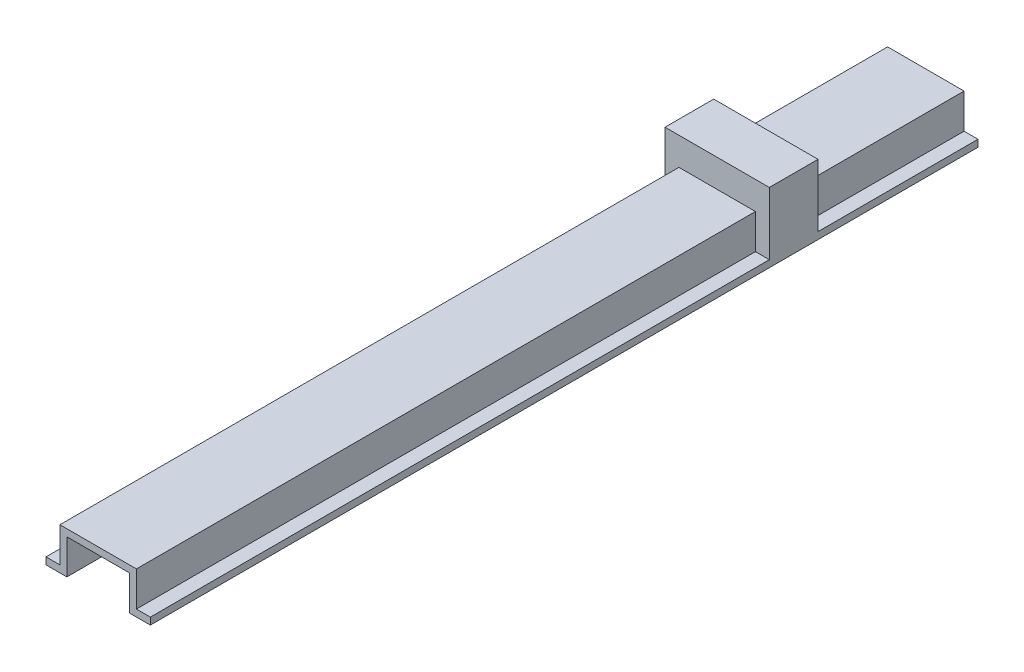
ISO-10303-21;
HEADER;
FILE_DESCRIPTION(('STEP AP214'),'2;1');
FILE_NAME('part.step','',(''),(''),'','','');
FILE_SCHEMA(('AUTOMOTIVE_DESIGN { 1 0 10303 214 1 1 1 1 }'));
ENDSEC;
DATA;
#1=APPLICATION_CONTEXT('core data for automotive mechanical design processes');
#2=APPLICATION_PROTOCOL_DEFINITION('international standard','automotive_design',2000,#1);
#3=PRODUCT_CONTEXT('',#1,'mechanical');
#4=PRODUCT('Part','Part','',(#3));
#5=PRODUCT_RELATED_PRODUCT_CATEGORY('part','',(#4));
#6=PRODUCT_DEFINITION_FORMATION('','',#4);
#7=PRODUCT_DEFINITION_CONTEXT('part definition',#1,'design');
#8=PRODUCT_DEFINITION('design','',#6,#7);
#9=PRODUCT_DEFINITION_SHAPE('','',#8);
#10=(LENGTH_UNIT() NAMED_UNIT(*) SI_UNIT(.MILLI.,.METRE.));
#11=(NAMED_UNIT(*) PLANE_ANGLE_UNIT() SI_UNIT($,.RADIAN.));
#12=(NAMED_UNIT(*) SI_UNIT($,.STERADIAN.) SOLID_ANGLE_UNIT());
#13=UNCERTAINTY_MEASURE_WITH_UNIT(LENGTH_MEASURE(1.E-05),#10,'distance_accuracy_value','');
#14=(GEOMETRIC_REPRESENTATION_CONTEXT(3) GLOBAL_UNCERTAINTY_ASSIGNED_CONTEXT((#13)) GLOBAL_UNIT_ASSIGNED_CONTEXT((#10,
#11,#12)) REPRESENTATION_CONTEXT('',''));
#15=CARTESIAN_POINT('',(0.,0.,0.));
#16=DIRECTION('',(0.,0.,1.));
#17=DIRECTION('',(1.,0.,0.));
#18=AXIS2_PLACEMENT_3D('',#15,#16,#17);
#19=CARTESIAN_POINT('',(-4.36598484476296,1.814,119.));
#20=DIRECTION('',(0.,1.,0.));
#21=DIRECTION('',(-1.,0.,0.));
#22=AXIS2_PLACEMENT_3D('',#19,#20,#21);
#23=PLANE('',#22);
#24=DIRECTION('',(0.,0.,-1.));
#25=VECTOR('',#24,1.);
#26=CARTESIAN_POINT('',(4.63401515523704,1.814,119.));
#27=LINE('',#26,#25);
#28=CARTESIAN_POINT('',(4.63401515523704,1.814,24.));
#29=VERTEX_POINT('',#28);
#30=CARTESIAN_POINT('',(4.63401515523704,1.814,0.));
#31=VERTEX_POINT('',#30);
#32=EDGE_CURVE('E320',#29,#31,#27,.T.);
#33=ORIENTED_EDGE('',*,*,#32,.F.);
#34=DIRECTION('',(-1.,0.,0.));
#35=VECTOR('',#34,1.);
#36=CARTESIAN_POINT('',(-4.36598484476296,1.814,24.));
#37=LINE('',#36,#35);
#38=CARTESIAN_POINT('',(-4.36598484476296,1.814,24.));
#39=VERTEX_POINT('',#38);
#40=EDGE_CURVE('E250',#29,#39,#37,.T.);
#41=ORIENTED_EDGE('',*,*,#40,.T.);
#42=DIRECTION('',(0.,0.,-1.));
#43=VECTOR('',#42,1.);
#44=CARTESIAN_POINT('',(-4.36598484476296,1.814,119.));
#45=LINE('',#44,#43);
#46=CARTESIAN_POINT('',(-4.36598484476296,1.814,0.));
#47=VERTEX_POINT('',#46);
#48=EDGE_CURVE('E353',#39,#47,#45,.T.);
#49=ORIENTED_EDGE('',*,*,#48,.T.);
#50=DIRECTION('',(1.,0.,0.));
#51=VECTOR('',#50,1.);
#52=CARTESIAN_POINT('',(-4.36598484476296,1.814,0.));
#53=LINE('',#52,#51);
#54=EDGE_CURVE('E348',#47,#31,#53,.T.);
#55=ORIENTED_EDGE('',*,*,#54,.T.);
#56=EDGE_LOOP('',(#33,#41,#49,#55));
#57=FACE_BOUND('',#56,.T.);
#58=ADVANCED_FACE('F33',(#57),#23,.F.);
#59=CARTESIAN_POINT('',(7.63401515523704,-2.186,119.));
#60=DIRECTION('',(0.,-1.,0.));
#61=DIRECTION('',(1.,0.,0.));
#62=AXIS2_PLACEMENT_3D('',#59,#60,#61);
#63=PLANE('',#62);
#64=DIRECTION('',(-1.,0.,0.));
#65=VECTOR('',#64,1.);
#66=CARTESIAN_POINT('',(-7.36598484476296,-2.186,23.));
#67=LINE('',#66,#65);
#68=CARTESIAN_POINT('',(7.63401515523704,-2.18599999999999,23.));
#69=VERTEX_POINT('',#68);
#70=CARTESIAN_POINT('',(5.63401515523704,-2.18599999999999,23.));
#71=VERTEX_POINT('',#70);
#72=EDGE_CURVE('E268',#69,#71,#67,.T.);
#73=ORIENTED_EDGE('',*,*,#72,.F.);
#74=DIRECTION('',(0.,0.,-1.));
#75=VECTOR('',#74,1.);
#76=CARTESIAN_POINT('',(7.63401515523704,-2.186,119.));
#77=LINE('',#76,#75);
#78=CARTESIAN_POINT('',(7.63401515523704,-2.186,0.));
#79=VERTEX_POINT('',#78);
#80=EDGE_CURVE('E383',#69,#79,#77,.T.);
#81=ORIENTED_EDGE('',*,*,#80,.T.);
#82=DIRECTION('',(-1.,0.,0.));
#83=VECTOR('',#82,1.);
#84=CARTESIAN_POINT('',(7.63401515523704,-2.186,0.));
#85=LINE('',#84,#83);
#86=CARTESIAN_POINT('',(5.63401515523704,-2.186,0.));
#87=VERTEX_POINT('',#86);
#88=EDGE_CURVE('E325',#79,#87,#85,.T.);
#89=ORIENTED_EDGE('',*,*,#88,.T.);
#90=DIRECTION('',(0.,0.,-1.));
#91=VECTOR('',#90,1.);
#92=CARTESIAN_POINT('',(5.63401515523704,-2.186,119.));
#93=LINE('',#92,#91);
#94=EDGE_CURVE('E379',#71,#87,#93,.T.);
#95=ORIENTED_EDGE('',*,*,#94,.F.);
#96=EDGE_LOOP('',(#73,#81,#89,#95));
#97=FACE_BOUND('',#96,.T.);
#98=ADVANCED_FACE('F405',(#97),#63,.F.);
#99=DIRECTION('',(1.,0.,0.));
#100=VECTOR('',#99,1.);
#101=CARTESIAN_POINT('',(-7.36598484476296,-2.186,30.));
#102=LINE('',#101,#100);
#103=CARTESIAN_POINT('',(5.63401515523704,-2.18599999999999,30.));
#104=VERTEX_POINT('',#103);
#105=CARTESIAN_POINT('',(7.63401515523704,-2.18599999999999,30.));
#106=VERTEX_POINT('',#105);
#107=EDGE_CURVE('E270',#104,#106,#102,.T.);
#108=ORIENTED_EDGE('',*,*,#107,.F.);
#109=CARTESIAN_POINT('',(5.63401515523704,-2.186,119.));
#110=VERTEX_POINT('',#109);
#111=EDGE_CURVE('E380',#110,#104,#93,.T.);
#112=ORIENTED_EDGE('',*,*,#111,.F.);
#113=DIRECTION('',(-1.,0.,0.));
#114=VECTOR('',#113,1.);
#115=CARTESIAN_POINT('',(7.63401515523704,-2.186,119.));
#116=LINE('',#115,#114);
#117=CARTESIAN_POINT('',(7.63401515523704,-2.186,119.));
#118=VERTEX_POINT('',#117);
#119=EDGE_CURVE('E301',#118,#110,#116,.T.);
#120=ORIENTED_EDGE('',*,*,#119,.F.);
#121=EDGE_CURVE('E384',#118,#106,#77,.T.);
#122=ORIENTED_EDGE('',*,*,#121,.T.);
#123=EDGE_LOOP('',(#108,#112,#120,#122));
#124=FACE_BOUND('',#123,.T.);
#125=ADVANCED_FACE('F424',(#124),#63,.F.);
#126=CARTESIAN_POINT('',(5.63401515523704,2.814,119.));
#127=DIRECTION('',(-1.,0.,0.));
#128=DIRECTION('',(0.,-1.,0.));
#129=AXIS2_PLACEMENT_3D('',#126,#127,#128);
#130=PLANE('',#129);
#131=DIRECTION('',(0.,1.,0.));
#132=VECTOR('',#131,1.);
#133=CARTESIAN_POINT('',(5.63401515523704,2.814,23.));
#134=LINE('',#133,#132);
#135=CARTESIAN_POINT('',(5.63401515523704,2.814,23.));
#136=VERTEX_POINT('',#135);
#137=EDGE_CURVE('E290',#71,#136,#134,.T.);
#138=ORIENTED_EDGE('',*,*,#137,.F.);
#139=ORIENTED_EDGE('',*,*,#94,.T.);
#140=DIRECTION('',(0.,1.,0.));
#141=VECTOR('',#140,1.);
#142=CARTESIAN_POINT('',(5.63401515523704,2.814,0.));
#143=LINE('',#142,#141);
#144=CARTESIAN_POINT('',(5.63401515523704,2.814,0.));
#145=VERTEX_POINT('',#144);
#146=EDGE_CURVE('E328',#87,#145,#143,.T.);
#147=ORIENTED_EDGE('',*,*,#146,.T.);
#148=DIRECTION('',(0.,0.,-1.));
#149=VECTOR('',#148,1.);
#150=CARTESIAN_POINT('',(5.63401515523704,2.814,119.));
#151=LINE('',#150,#149);
#152=EDGE_CURVE('E375',#136,#145,#151,.T.);
#153=ORIENTED_EDGE('',*,*,#152,.F.);
#154=EDGE_LOOP('',(#138,#139,#147,#153));
#155=FACE_BOUND('',#154,.T.);
#156=ADVANCED_FACE('F465',(#155),#130,.F.);
#157=DIRECTION('',(0.,-1.,0.));
#158=VECTOR('',#157,1.);
#159=CARTESIAN_POINT('',(5.63401515523704,2.814,30.));
#160=LINE('',#159,#158);
#161=CARTESIAN_POINT('',(5.63401515523704,2.814,30.));
#162=VERTEX_POINT('',#161);
#163=EDGE_CURVE('E284',#162,#104,#160,.T.);
#164=ORIENTED_EDGE('',*,*,#163,.F.);
#165=CARTESIAN_POINT('',(5.63401515523704,2.814,119.));
#166=VERTEX_POINT('',#165);
#167=EDGE_CURVE('E376',#166,#162,#151,.T.);
#168=ORIENTED_EDGE('',*,*,#167,.F.);
#169=DIRECTION('',(0.,1.,0.));
#170=VECTOR('',#169,1.);
#171=CARTESIAN_POINT('',(5.63401515523704,2.814,119.));
#172=LINE('',#171,#170);
#173=EDGE_CURVE('E303',#110,#166,#172,.T.);
#174=ORIENTED_EDGE('',*,*,#173,.F.);
#175=ORIENTED_EDGE('',*,*,#111,.T.);
#176=EDGE_LOOP('',(#164,#168,#174,#175));
#177=FACE_BOUND('',#176,.T.);
#178=ADVANCED_FACE('F467',(#177),#130,.F.);
#179=CARTESIAN_POINT('',(-5.36598484476296,2.814,119.));
#180=DIRECTION('',(0.,-1.,0.));
#181=DIRECTION('',(1.,0.,0.));
#182=AXIS2_PLACEMENT_3D('',#179,#180,#181);
#183=PLANE('',#182);
#184=DIRECTION('',(-1.,0.,0.));
#185=VECTOR('',#184,1.);
#186=CARTESIAN_POINT('',(-5.36598484476296,2.814,23.));
#187=LINE('',#186,#185);
#188=CARTESIAN_POINT('',(-5.36598484476296,2.814,23.));
#189=VERTEX_POINT('',#188);
#190=EDGE_CURVE('E288',#136,#189,#187,.T.);
#191=ORIENTED_EDGE('',*,*,#190,.F.);
#192=ORIENTED_EDGE('',*,*,#152,.T.);
#193=DIRECTION('',(-1.,0.,0.));
#194=VECTOR('',#193,1.);
#195=CARTESIAN_POINT('',(-5.36598484476296,2.814,0.));
#196=LINE('',#195,#194);
#197=CARTESIAN_POINT('',(-5.36598484476296,2.814,0.));
#198=VERTEX_POINT('',#197);
#199=EDGE_CURVE('E331',#145,#198,#196,.T.);
#200=ORIENTED_EDGE('',*,*,#199,.T.);
#201=DIRECTION('',(0.,0.,-1.));
#202=VECTOR('',#201,1.);
#203=CARTESIAN_POINT('',(-5.36598484476296,2.814,119.));
#204=LINE('',#203,#202);
#205=EDGE_CURVE('E371',#189,#198,#204,.T.);
#206=ORIENTED_EDGE('',*,*,#205,.F.);
#207=EDGE_LOOP('',(#191,#192,#200,#206));
#208=FACE_BOUND('',#207,.T.);
#209=ADVANCED_FACE('F462',(#208),#183,.F.);
#210=DIRECTION('',(1.,0.,0.));
#211=VECTOR('',#210,1.);
#212=CARTESIAN_POINT('',(-5.36598484476296,2.814,30.));
#213=LINE('',#212,#211);
#214=CARTESIAN_POINT('',(-5.36598484476296,2.814,30.));
#215=VERTEX_POINT('',#214);
#216=EDGE_CURVE('E282',#215,#162,#213,.T.);
#217=ORIENTED_EDGE('',*,*,#216,.F.);
#218=CARTESIAN_POINT('',(-5.36598484476296,2.814,119.));
#219=VERTEX_POINT('',#218);
#220=EDGE_CURVE('E372',#219,#215,#204,.T.);
#221=ORIENTED_EDGE('',*,*,#220,.F.);
#222=DIRECTION('',(-1.,0.,0.));
#223=VECTOR('',#222,1.);
#224=CARTESIAN_POINT('',(-5.36598484476296,2.814,119.));
#225=LINE('',#224,#223);
#226=EDGE_CURVE('E305',#166,#219,#225,.T.);
#227=ORIENTED_EDGE('',*,*,#226,.F.);
#228=ORIENTED_EDGE('',*,*,#167,.T.);
#229=EDGE_LOOP('',(#217,#221,#227,#228));
#230=FACE_BOUND('',#229,.T.);
#231=ADVANCED_FACE('F511',(#230),#183,.F.);
#232=CARTESIAN_POINT('',(-5.36598484476296,2.814,119.));
#233=DIRECTION('',(1.,0.,0.));
#234=DIRECTION('',(0.,1.,0.));
#235=AXIS2_PLACEMENT_3D('',#232,#233,#234);
#236=PLANE('',#235);
#237=DIRECTION('',(0.,-1.,0.));
#238=VECTOR('',#237,1.);
#239=CARTESIAN_POINT('',(-5.36598484476296,2.814,23.));
#240=LINE('',#239,#238);
#241=CARTESIAN_POINT('',(-5.36598484476296,-2.186,23.));
#242=VERTEX_POINT('',#241);
#243=EDGE_CURVE('E286',#189,#242,#240,.T.);
#244=ORIENTED_EDGE('',*,*,#243,.F.);
#245=ORIENTED_EDGE('',*,*,#205,.T.);
#246=DIRECTION('',(0.,-1.,0.));
#247=VECTOR('',#246,1.);
#248=CARTESIAN_POINT('',(-5.36598484476296,2.814,0.));
#249=LINE('',#248,#247);
#250=CARTESIAN_POINT('',(-5.36598484476296,-2.186,0.));
#251=VERTEX_POINT('',#250);
#252=EDGE_CURVE('E334',#198,#251,#249,.T.);
#253=ORIENTED_EDGE('',*,*,#252,.T.);
#254=DIRECTION('',(0.,0.,-1.));
#255=VECTOR('',#254,1.);
#256=CARTESIAN_POINT('',(-5.36598484476296,-2.186,119.));
#257=LINE('',#256,#255);
#258=EDGE_CURVE('E367',#242,#251,#257,.T.);
#259=ORIENTED_EDGE('',*,*,#258,.F.);
#260=EDGE_LOOP('',(#244,#245,#253,#259));
#261=FACE_BOUND('',#260,.T.);
#262=ADVANCED_FACE('F458',(#261),#236,.F.);
#263=DIRECTION('',(0.,1.,0.));
#264=VECTOR('',#263,1.);
#265=CARTESIAN_POINT('',(-5.36598484476296,2.814,30.));
#266=LINE('',#265,#264);
#267=CARTESIAN_POINT('',(-5.36598484476296,-2.186,30.));
#268=VERTEX_POINT('',#267);
#269=EDGE_CURVE('E280',#268,#215,#266,.T.);
#270=ORIENTED_EDGE('',*,*,#269,.F.);
#271=CARTESIAN_POINT('',(-5.36598484476296,-2.186,119.));
#272=VERTEX_POINT('',#271);
#273=EDGE_CURVE('E368',#272,#268,#257,.T.);
#274=ORIENTED_EDGE('',*,*,#273,.F.);
#275=DIRECTION('',(0.,-1.,0.));
#276=VECTOR('',#275,1.);
#277=CARTESIAN_POINT('',(-5.36598484476296,2.814,119.));
#278=LINE('',#277,#276);
#279=EDGE_CURVE('E307',#219,#272,#278,.T.);
#280=ORIENTED_EDGE('',*,*,#279,.F.);
#281=ORIENTED_EDGE('',*,*,#220,.T.);
#282=EDGE_LOOP('',(#270,#274,#280,#281));
#283=FACE_BOUND('',#282,.T.);
#284=ADVANCED_FACE('F509',(#283),#236,.F.);
#285=CARTESIAN_POINT('',(-5.36598484476296,-2.186,119.));
#286=DIRECTION('',(0.,-1.,0.));
#287=DIRECTION('',(1.,0.,0.));
#288=AXIS2_PLACEMENT_3D('',#285,#286,#287);
#289=PLANE('',#288);
#290=CARTESIAN_POINT('',(-7.36598484476296,-2.186,23.));
#291=VERTEX_POINT('',#290);
#292=EDGE_CURVE('E256',#242,#291,#67,.T.);
#293=ORIENTED_EDGE('',*,*,#292,.F.);
#294=ORIENTED_EDGE('',*,*,#258,.T.);
#295=DIRECTION('',(-1.,0.,0.));
#296=VECTOR('',#295,1.);
#297=CARTESIAN_POINT('',(-5.36598484476296,-2.186,0.));
#298=LINE('',#297,#296);
#299=CARTESIAN_POINT('',(-7.36598484476296,-2.186,0.));
#300=VERTEX_POINT('',#299);
#301=EDGE_CURVE('E337',#251,#300,#298,.T.);
#302=ORIENTED_EDGE('',*,*,#301,.T.);
#303=DIRECTION('',(0.,0.,-1.));
#304=VECTOR('',#303,1.);
#305=CARTESIAN_POINT('',(-7.36598484476296,-2.186,119.));
#306=LINE('',#305,#304);
#307=EDGE_CURVE('E363',#291,#300,#306,.T.);
#308=ORIENTED_EDGE('',*,*,#307,.F.);
#309=EDGE_LOOP('',(#293,#294,#302,#308));
#310=FACE_BOUND('',#309,.T.);
#311=ADVANCED_FACE('F454',(#310),#289,.F.);
#312=CARTESIAN_POINT('',(-7.36598484476296,-2.186,30.));
#313=VERTEX_POINT('',#312);
#314=EDGE_CURVE('E261',#313,#268,#102,.T.);
#315=ORIENTED_EDGE('',*,*,#314,.F.);
#316=CARTESIAN_POINT('',(-7.36598484476296,-2.186,119.));
#317=VERTEX_POINT('',#316);
#318=EDGE_CURVE('E364',#317,#313,#306,.T.);
#319=ORIENTED_EDGE('',*,*,#318,.F.);
#320=DIRECTION('',(-1.,0.,0.));
#321=VECTOR('',#320,1.);
#322=CARTESIAN_POINT('',(-5.36598484476296,-2.186,119.));
#323=LINE('',#322,#321);
#324=EDGE_CURVE('E309',#272,#317,#323,.T.);
#325=ORIENTED_EDGE('',*,*,#324,.F.);
#326=ORIENTED_EDGE('',*,*,#273,.T.);
#327=EDGE_LOOP('',(#315,#319,#325,#326));
#328=FACE_BOUND('',#327,.T.);
#329=ADVANCED_FACE('F491',(#328),#289,.F.);
#330=CARTESIAN_POINT('',(-4.36598484476296,1.814,119.));
#331=DIRECTION('',(-1.,0.,0.));
#332=DIRECTION('',(0.,0.,1.));
#333=AXIS2_PLACEMENT_3D('',#330,#331,#332);
#334=PLANE('',#333);
#335=ORIENTED_EDGE('',*,*,#48,.F.);
#336=DIRECTION('',(0.,-1.,0.));
#337=VECTOR('',#336,1.);
#338=CARTESIAN_POINT('',(-4.36598484476296,1.814,24.));
#339=LINE('',#338,#337);
#340=CARTESIAN_POINT('',(-4.36598484476296,-1.186,24.));
#341=VERTEX_POINT('',#340);
#342=EDGE_CURVE('E253',#39,#341,#339,.T.);
#343=ORIENTED_EDGE('',*,*,#342,.T.);
#344=DIRECTION('',(0.,0.,1.));
#345=VECTOR('',#344,1.);
#346=CARTESIAN_POINT('',(-4.36598484476296,-1.186,119.));
#347=LINE('',#346,#345);
#348=CARTESIAN_POINT('',(-4.36598484476296,-1.186,29.));
#349=VERTEX_POINT('',#348);
#350=EDGE_CURVE('E240',#341,#349,#347,.T.);
#351=ORIENTED_EDGE('',*,*,#350,.T.);
#352=DIRECTION('',(0.,1.,0.));
#353=VECTOR('',#352,1.);
#354=CARTESIAN_POINT('',(-4.36598484476296,1.814,29.));
#355=LINE('',#354,#353);
#356=CARTESIAN_POINT('',(-4.36598484476296,1.814,29.));
#357=VERTEX_POINT('',#356);
#358=EDGE_CURVE('E247',#349,#357,#355,.T.);
#359=ORIENTED_EDGE('',*,*,#358,.T.);
#360=CARTESIAN_POINT('',(-4.36598484476296,1.814,119.));
#361=VERTEX_POINT('',#360);
#362=EDGE_CURVE('E354',#361,#357,#45,.T.);
#363=ORIENTED_EDGE('',*,*,#362,.F.);
#364=DIRECTION('',(0.,1.,0.));
#365=VECTOR('',#364,1.);
#366=CARTESIAN_POINT('',(-4.36598484476296,-2.186,119.));
#367=LINE('',#366,#365);
#368=CARTESIAN_POINT('',(-4.36598484476296,-3.186,119.));
#369=VERTEX_POINT('',#368);
#370=EDGE_CURVE('E315',#369,#361,#367,.T.);
#371=ORIENTED_EDGE('',*,*,#370,.F.);
#372=DIRECTION('',(0.,0.,-1.));
#373=VECTOR('',#372,1.);
#374=CARTESIAN_POINT('',(-4.36598484476296,-3.186,119.));
#375=LINE('',#374,#373);
#376=CARTESIAN_POINT('',(-4.36598484476296,-3.186,0.));
#377=VERTEX_POINT('',#376);
#378=EDGE_CURVE('E357',#369,#377,#375,.T.);
#379=ORIENTED_EDGE('',*,*,#378,.T.);
#380=DIRECTION('',(0.,1.,0.));
#381=VECTOR('',#380,1.);
#382=CARTESIAN_POINT('',(-4.36598484476296,1.814,0.));
#383=LINE('',#382,#381);
#384=EDGE_CURVE('E345',#377,#47,#383,.T.);
#385=ORIENTED_EDGE('',*,*,#384,.T.);
#386=EDGE_LOOP('',(#335,#343,#351,#359,#363,#371,#379,#385));
#387=FACE_BOUND('',#386,.T.);
#388=ADVANCED_FACE('F437',(#387),#334,.F.);
#389=ORIENTED_EDGE('',*,*,#362,.T.);
#390=DIRECTION('',(1.,0.,0.));
#391=VECTOR('',#390,1.);
#392=CARTESIAN_POINT('',(-4.36598484476296,1.814,29.));
#393=LINE('',#392,#391);
#394=CARTESIAN_POINT('',(4.63401515523704,1.814,29.));
#395=VERTEX_POINT('',#394);
#396=EDGE_CURVE('E245',#357,#395,#393,.T.);
#397=ORIENTED_EDGE('',*,*,#396,.T.);
#398=CARTESIAN_POINT('',(4.63401515523704,1.814,119.));
#399=VERTEX_POINT('',#398);
#400=EDGE_CURVE('E212',#399,#395,#27,.T.);
#401=ORIENTED_EDGE('',*,*,#400,.F.);
#402=DIRECTION('',(1.,0.,0.));
#403=VECTOR('',#402,1.);
#404=CARTESIAN_POINT('',(-4.36598484476296,1.814,119.));
#405=LINE('',#404,#403);
#406=EDGE_CURVE('E317',#361,#399,#405,.T.);
#407=ORIENTED_EDGE('',*,*,#406,.F.);
#408=EDGE_LOOP('',(#389,#397,#401,#407));
#409=FACE_BOUND('',#408,.T.);
#410=ADVANCED_FACE('F478',(#409),#23,.F.);
#411=CARTESIAN_POINT('',(4.63401515523704,1.814,119.));
#412=DIRECTION('',(1.,0.,0.));
#413=DIRECTION('',(0.,0.,-1.));
#414=AXIS2_PLACEMENT_3D('',#411,#412,#413);
#415=PLANE('',#414);
#416=ORIENTED_EDGE('',*,*,#400,.T.);
#417=DIRECTION('',(0.,1.,0.));
#418=VECTOR('',#417,1.);
#419=CARTESIAN_POINT('',(4.63401515523704,5.81400000000001,29.));
#420=LINE('',#419,#418);
#421=CARTESIAN_POINT('',(4.63401515523704,5.81400000000001,29.));
#422=VERTEX_POINT('',#421);
#423=EDGE_CURVE('E206',#395,#422,#420,.T.);
#424=ORIENTED_EDGE('',*,*,#423,.T.);
#425=DIRECTION('',(0.,0.,-1.));
#426=VECTOR('',#425,1.);
#427=CARTESIAN_POINT('',(4.63401515523704,5.81400000000001,24.));
#428=LINE('',#427,#426);
#429=CARTESIAN_POINT('',(4.63401515523704,5.81400000000001,24.));
#430=VERTEX_POINT('',#429);
#431=EDGE_CURVE('E210',#422,#430,#428,.T.);
#432=ORIENTED_EDGE('',*,*,#431,.T.);
#433=DIRECTION('',(0.,-1.,0.));
#434=VECTOR('',#433,1.);
#435=CARTESIAN_POINT('',(4.63401515523704,5.81400000000001,24.));
#436=LINE('',#435,#434);
#437=EDGE_CURVE('E48',#430,#29,#436,.T.);
#438=ORIENTED_EDGE('',*,*,#437,.T.);
#439=ORIENTED_EDGE('',*,*,#32,.T.);
#440=DIRECTION('',(0.,-1.,0.));
#441=VECTOR('',#440,1.);
#442=CARTESIAN_POINT('',(4.63401515523704,1.814,0.));
#443=LINE('',#442,#441);
#444=CARTESIAN_POINT('',(4.63401515523704,-3.186,0.));
#445=VERTEX_POINT('',#444);
#446=EDGE_CURVE('E297',#31,#445,#443,.T.);
#447=ORIENTED_EDGE('',*,*,#446,.T.);
#448=DIRECTION('',(0.,0.,-1.));
#449=VECTOR('',#448,1.);
#450=CARTESIAN_POINT('',(4.63401515523704,-3.186,119.));
#451=LINE('',#450,#449);
#452=CARTESIAN_POINT('',(4.63401515523704,-3.186,119.));
#453=VERTEX_POINT('',#452);
#454=EDGE_CURVE('E11',#453,#445,#451,.T.);
#455=ORIENTED_EDGE('',*,*,#454,.F.);
#456=DIRECTION('',(0.,-1.,0.));
#457=VECTOR('',#456,1.);
#458=CARTESIAN_POINT('',(4.63401515523704,-2.186,119.));
#459=LINE('',#458,#457);
#460=EDGE_CURVE('E293',#399,#453,#459,.T.);
#461=ORIENTED_EDGE('',*,*,#460,.F.);
#462=EDGE_LOOP('',(#416,#424,#432,#438,#439,#447,#455,#461));
#463=FACE_BOUND('',#462,.T.);
#464=ADVANCED_FACE('F208',(#463),#415,.F.);
#465=CARTESIAN_POINT('',(4.63401515523704,-3.186,119.));
#466=DIRECTION('',(0.,1.,0.));
#467=DIRECTION('',(0.,0.,1.));
#468=AXIS2_PLACEMENT_3D('',#465,#466,#467);
#469=PLANE('',#468);
#470=DIRECTION('',(1.,0.,0.));
#471=VECTOR('',#470,1.);
#472=CARTESIAN_POINT('',(4.63401515523704,-3.186,0.));
#473=LINE('',#472,#471);
#474=CARTESIAN_POINT('',(7.63401515523704,-3.186,0.));
#475=VERTEX_POINT('',#474);
#476=EDGE_CURVE('E292',#445,#475,#473,.T.);
#477=ORIENTED_EDGE('',*,*,#476,.T.);
#478=DIRECTION('',(0.,0.,-1.));
#479=VECTOR('',#478,1.);
#480=CARTESIAN_POINT('',(7.63401515523704,-3.186,119.));
#481=LINE('',#480,#479);
#482=CARTESIAN_POINT('',(7.63401515523704,-3.186,119.));
#483=VERTEX_POINT('',#482);
#484=EDGE_CURVE('E41',#483,#475,#481,.T.);
#485=ORIENTED_EDGE('',*,*,#484,.F.);
#486=DIRECTION('',(1.,0.,0.));
#487=VECTOR('',#486,1.);
#488=CARTESIAN_POINT('',(4.63401515523704,-3.186,119.));
#489=LINE('',#488,#487);
#490=EDGE_CURVE('E296',#453,#483,#489,.T.);
#491=ORIENTED_EDGE('',*,*,#490,.F.);
#492=ORIENTED_EDGE('',*,*,#454,.T.);
#493=EDGE_LOOP('',(#477,#485,#491,#492));
#494=FACE_BOUND('',#493,.T.);
#495=ADVANCED_FACE('F35',(#494),#469,.F.);
#496=CARTESIAN_POINT('',(7.63401515523704,-2.186,119.));
#497=DIRECTION('',(-1.,0.,0.));
#498=DIRECTION('',(0.,0.,1.));
#499=AXIS2_PLACEMENT_3D('',#496,#497,#498);
#500=PLANE('',#499);
#501=DIRECTION('',(0.,1.,0.));
#502=VECTOR('',#501,1.);
#503=CARTESIAN_POINT('',(7.63401515523704,-2.186,0.));
#504=LINE('',#503,#502);
#505=EDGE_CURVE('E322',#475,#79,#504,.T.);
#506=ORIENTED_EDGE('',*,*,#505,.T.);
#507=ORIENTED_EDGE('',*,*,#80,.F.);
#508=DIRECTION('',(0.,-1.,0.));
#509=VECTOR('',#508,1.);
#510=CARTESIAN_POINT('',(7.63401515523704,6.81400000000001,23.));
#511=LINE('',#510,#509);
#512=CARTESIAN_POINT('',(7.63401515523704,6.81400000000001,23.));
#513=VERTEX_POINT('',#512);
#514=EDGE_CURVE('E278',#513,#69,#511,.T.);
#515=ORIENTED_EDGE('',*,*,#514,.F.);
#516=DIRECTION('',(0.,0.,-1.));
#517=VECTOR('',#516,1.);
#518=CARTESIAN_POINT('',(7.63401515523704,6.81400000000001,23.));
#519=LINE('',#518,#517);
#520=CARTESIAN_POINT('',(7.63401515523704,6.81400000000001,30.));
#521=VERTEX_POINT('',#520);
#522=EDGE_CURVE('E257',#521,#513,#519,.T.);
#523=ORIENTED_EDGE('',*,*,#522,.F.);
#524=DIRECTION('',(0.,-1.,0.));
#525=VECTOR('',#524,1.);
#526=CARTESIAN_POINT('',(7.63401515523704,6.81400000000001,30.));
#527=LINE('',#526,#525);
#528=EDGE_CURVE('E267',#521,#106,#527,.T.);
#529=ORIENTED_EDGE('',*,*,#528,.T.);
#530=ORIENTED_EDGE('',*,*,#121,.F.);
#531=DIRECTION('',(0.,1.,0.));
#532=VECTOR('',#531,1.);
#533=CARTESIAN_POINT('',(7.63401515523704,-2.186,119.));
#534=LINE('',#533,#532);
#535=EDGE_CURVE('E299',#483,#118,#534,.T.);
#536=ORIENTED_EDGE('',*,*,#535,.F.);
#537=ORIENTED_EDGE('',*,*,#484,.T.);
#538=EDGE_LOOP('',(#506,#507,#515,#523,#529,#530,#536,#537));
#539=FACE_BOUND('',#538,.T.);
#540=ADVANCED_FACE('F391',(#539),#500,.F.);
#541=CARTESIAN_POINT('',(-7.36598484476296,-2.186,119.));
#542=DIRECTION('',(1.,0.,0.));
#543=DIRECTION('',(0.,1.,0.));
#544=AXIS2_PLACEMENT_3D('',#541,#542,#543);
#545=PLANE('',#544);
#546=DIRECTION('',(0.,0.,1.));
#547=VECTOR('',#546,1.);
#548=CARTESIAN_POINT('',(-7.36598484476296,-1.186,24.));
#549=LINE('',#548,#547);
#550=CARTESIAN_POINT('',(-7.36598484476296,-1.186,24.));
#551=VERTEX_POINT('',#550);
#552=CARTESIAN_POINT('',(-7.36598484476296,-1.186,29.));
#553=VERTEX_POINT('',#552);
#554=EDGE_CURVE('E234',#551,#553,#549,.T.);
#555=ORIENTED_EDGE('',*,*,#554,.F.);
#556=DIRECTION('',(0.,-1.,0.));
#557=VECTOR('',#556,1.);
#558=CARTESIAN_POINT('',(-7.36598484476297,5.814,24.));
#559=LINE('',#558,#557);
#560=CARTESIAN_POINT('',(-7.36598484476297,5.814,24.));
#561=VERTEX_POINT('',#560);
#562=EDGE_CURVE('E56',#561,#551,#559,.T.);
#563=ORIENTED_EDGE('',*,*,#562,.F.);
#564=DIRECTION('',(0.,0.,-1.));
#565=VECTOR('',#564,1.);
#566=CARTESIAN_POINT('',(-7.36598484476297,5.814,24.));
#567=LINE('',#566,#565);
#568=CARTESIAN_POINT('',(-7.36598484476297,5.814,29.));
#569=VERTEX_POINT('',#568);
#570=EDGE_CURVE('E238',#569,#561,#567,.T.);
#571=ORIENTED_EDGE('',*,*,#570,.F.);
#572=DIRECTION('',(0.,1.,0.));
#573=VECTOR('',#572,1.);
#574=CARTESIAN_POINT('',(-7.36598484476297,5.814,29.));
#575=LINE('',#574,#573);
#576=EDGE_CURVE('E220',#553,#569,#575,.T.);
#577=ORIENTED_EDGE('',*,*,#576,.F.);
#578=EDGE_LOOP('',(#555,#563,#571,#577));
#579=FACE_BOUND('',#578,.T.);
#580=DIRECTION('',(0.,-1.,0.));
#581=VECTOR('',#580,1.);
#582=CARTESIAN_POINT('',(-7.36598484476296,-2.186,0.));
#583=LINE('',#582,#581);
#584=CARTESIAN_POINT('',(-7.36598484476296,-3.186,0.));
#585=VERTEX_POINT('',#584);
#586=EDGE_CURVE('E340',#300,#585,#583,.T.);
#587=ORIENTED_EDGE('',*,*,#586,.T.);
#588=DIRECTION('',(0.,0.,-1.));
#589=VECTOR('',#588,1.);
#590=CARTESIAN_POINT('',(-7.36598484476296,-3.186,119.));
#591=LINE('',#590,#589);
#592=CARTESIAN_POINT('',(-7.36598484476296,-3.186,119.));
#593=VERTEX_POINT('',#592);
#594=EDGE_CURVE('E360',#593,#585,#591,.T.);
#595=ORIENTED_EDGE('',*,*,#594,.F.);
#596=DIRECTION('',(0.,-1.,0.));
#597=VECTOR('',#596,1.);
#598=CARTESIAN_POINT('',(-7.36598484476296,-2.186,119.));
#599=LINE('',#598,#597);
#600=EDGE_CURVE('E311',#317,#593,#599,.T.);
#601=ORIENTED_EDGE('',*,*,#600,.F.);
#602=ORIENTED_EDGE('',*,*,#318,.T.);
#603=DIRECTION('',(0.,-1.,0.));
#604=VECTOR('',#603,1.);
#605=CARTESIAN_POINT('',(-7.36598484476296,6.814,30.));
#606=LINE('',#605,#604);
#607=CARTESIAN_POINT('',(-7.36598484476296,6.814,30.));
#608=VERTEX_POINT('',#607);
#609=EDGE_CURVE('E274',#608,#313,#606,.T.);
#610=ORIENTED_EDGE('',*,*,#609,.F.);
#611=DIRECTION('',(0.,0.,1.));
#612=VECTOR('',#611,1.);
#613=CARTESIAN_POINT('',(-7.36598484476296,6.814,23.));
#614=LINE('',#613,#612);
#615=CARTESIAN_POINT('',(-7.36598484476296,6.814,23.));
#616=VERTEX_POINT('',#615);
#617=EDGE_CURVE('E263',#616,#608,#614,.T.);
#618=ORIENTED_EDGE('',*,*,#617,.F.);
#619=DIRECTION('',(0.,-1.,0.));
#620=VECTOR('',#619,1.);
#621=CARTESIAN_POINT('',(-7.36598484476296,6.814,23.));
#622=LINE('',#621,#620);
#623=EDGE_CURVE('E276',#616,#291,#622,.T.);
#624=ORIENTED_EDGE('',*,*,#623,.T.);
#625=ORIENTED_EDGE('',*,*,#307,.T.);
#626=EDGE_LOOP('',(#587,#595,#601,#602,#610,#618,#624,#625));
#627=FACE_BOUND('',#626,.T.);
#628=ADVANCED_FACE('F449',(#579,#627),#545,.F.);
#629=CARTESIAN_POINT('',(-4.36598484476296,-3.186,119.));
#630=DIRECTION('',(0.,1.,0.));
#631=DIRECTION('',(-1.,0.,0.));
#632=AXIS2_PLACEMENT_3D('',#629,#630,#631);
#633=PLANE('',#632);
#634=DIRECTION('',(1.,0.,0.));
#635=VECTOR('',#634,1.);
#636=CARTESIAN_POINT('',(-4.36598484476296,-3.186,0.));
#637=LINE('',#636,#635);
#638=EDGE_CURVE('E342',#585,#377,#637,.T.);
#639=ORIENTED_EDGE('',*,*,#638,.T.);
#640=ORIENTED_EDGE('',*,*,#378,.F.);
#641=DIRECTION('',(1.,0.,0.));
#642=VECTOR('',#641,1.);
#643=CARTESIAN_POINT('',(-4.36598484476296,-3.186,119.));
#644=LINE('',#643,#642);
#645=EDGE_CURVE('E313',#593,#369,#644,.T.);
#646=ORIENTED_EDGE('',*,*,#645,.F.);
#647=ORIENTED_EDGE('',*,*,#594,.T.);
#648=EDGE_LOOP('',(#639,#640,#646,#647));
#649=FACE_BOUND('',#648,.T.);
#650=ADVANCED_FACE('F443',(#649),#633,.F.);
#651=CARTESIAN_POINT('',(0.,0.,119.));
#652=DIRECTION('',(0.,0.,1.));
#653=DIRECTION('',(1.,0.,0.));
#654=AXIS2_PLACEMENT_3D('',#651,#652,#653);
#655=PLANE('',#654);
#656=ORIENTED_EDGE('',*,*,#460,.T.);
#657=ORIENTED_EDGE('',*,*,#490,.T.);
#658=ORIENTED_EDGE('',*,*,#535,.T.);
#659=ORIENTED_EDGE('',*,*,#119,.T.);
#660=ORIENTED_EDGE('',*,*,#173,.T.);
#661=ORIENTED_EDGE('',*,*,#226,.T.);
#662=ORIENTED_EDGE('',*,*,#279,.T.);
#663=ORIENTED_EDGE('',*,*,#324,.T.);
#664=ORIENTED_EDGE('',*,*,#600,.T.);
#665=ORIENTED_EDGE('',*,*,#645,.T.);
#666=ORIENTED_EDGE('',*,*,#370,.T.);
#667=ORIENTED_EDGE('',*,*,#406,.T.);
#668=EDGE_LOOP('',(#656,#657,#658,#659,#660,#661,#662,#663,#664,#665,#666,#667));
#669=FACE_BOUND('',#668,.T.);
#670=ADVANCED_FACE('F428',(#669),#655,.T.);
#671=CARTESIAN_POINT('',(0.,0.,0.));
#672=DIRECTION('',(0.,0.,1.));
#673=DIRECTION('',(1.,0.,0.));
#674=AXIS2_PLACEMENT_3D('',#671,#672,#673);
#675=PLANE('',#674);
#676=ORIENTED_EDGE('',*,*,#476,.F.);
#677=ORIENTED_EDGE('',*,*,#446,.F.);
#678=ORIENTED_EDGE('',*,*,#54,.F.);
#679=ORIENTED_EDGE('',*,*,#384,.F.);
#680=ORIENTED_EDGE('',*,*,#638,.F.);
#681=ORIENTED_EDGE('',*,*,#586,.F.);
#682=ORIENTED_EDGE('',*,*,#301,.F.);
#683=ORIENTED_EDGE('',*,*,#252,.F.);
#684=ORIENTED_EDGE('',*,*,#199,.F.);
#685=ORIENTED_EDGE('',*,*,#146,.F.);
#686=ORIENTED_EDGE('',*,*,#88,.F.);
#687=ORIENTED_EDGE('',*,*,#505,.F.);
#688=EDGE_LOOP('',(#676,#677,#678,#679,#680,#681,#682,#683,#684,#685,#686,#687));
#689=FACE_BOUND('',#688,.T.);
#690=ADVANCED_FACE('F398',(#689),#675,.F.);
#691=CARTESIAN_POINT('',(-7.36598484476296,6.814,23.));
#692=DIRECTION('',(0.,0.,1.));
#693=DIRECTION('',(1.,0.,0.));
#694=AXIS2_PLACEMENT_3D('',#691,#692,#693);
#695=PLANE('',#694);
#696=ORIENTED_EDGE('',*,*,#72,.T.);
#697=ORIENTED_EDGE('',*,*,#137,.T.);
#698=ORIENTED_EDGE('',*,*,#190,.T.);
#699=ORIENTED_EDGE('',*,*,#243,.T.);
#700=ORIENTED_EDGE('',*,*,#292,.T.);
#701=ORIENTED_EDGE('',*,*,#623,.F.);
#702=DIRECTION('',(-1.,0.,0.));
#703=VECTOR('',#702,1.);
#704=CARTESIAN_POINT('',(-7.36598484476296,6.814,23.));
#705=LINE('',#704,#703);
#706=EDGE_CURVE('E260',#513,#616,#705,.T.);
#707=ORIENTED_EDGE('',*,*,#706,.F.);
#708=ORIENTED_EDGE('',*,*,#514,.T.);
#709=EDGE_LOOP('',(#696,#697,#698,#699,#700,#701,#707,#708));
#710=FACE_BOUND('',#709,.T.);
#711=ADVANCED_FACE('F409',(#710),#695,.F.);
#712=CARTESIAN_POINT('',(-7.36598484476296,6.814,30.));
#713=DIRECTION('',(0.,0.,-1.));
#714=DIRECTION('',(-1.,0.,0.));
#715=AXIS2_PLACEMENT_3D('',#712,#713,#714);
#716=PLANE('',#715);
#717=ORIENTED_EDGE('',*,*,#216,.T.);
#718=ORIENTED_EDGE('',*,*,#163,.T.);
#719=ORIENTED_EDGE('',*,*,#107,.T.);
#720=ORIENTED_EDGE('',*,*,#528,.F.);
#721=DIRECTION('',(1.,0.,0.));
#722=VECTOR('',#721,1.);
#723=CARTESIAN_POINT('',(-7.36598484476296,6.814,30.));
#724=LINE('',#723,#722);
#725=EDGE_CURVE('E265',#608,#521,#724,.T.);
#726=ORIENTED_EDGE('',*,*,#725,.F.);
#727=ORIENTED_EDGE('',*,*,#609,.T.);
#728=ORIENTED_EDGE('',*,*,#314,.T.);
#729=ORIENTED_EDGE('',*,*,#269,.T.);
#730=EDGE_LOOP('',(#717,#718,#719,#720,#726,#727,#728,#729));
#731=FACE_BOUND('',#730,.T.);
#732=ADVANCED_FACE('F420',(#731),#716,.F.);
#733=CARTESIAN_POINT('',(0.,6.814,0.));
#734=DIRECTION('',(0.,1.,0.));
#735=DIRECTION('',(-1.,0.,0.));
#736=AXIS2_PLACEMENT_3D('',#733,#734,#735);
#737=PLANE('',#736);
#738=ORIENTED_EDGE('',*,*,#522,.T.);
#739=ORIENTED_EDGE('',*,*,#706,.T.);
#740=ORIENTED_EDGE('',*,*,#617,.T.);
#741=ORIENTED_EDGE('',*,*,#725,.T.);
#742=EDGE_LOOP('',(#738,#739,#740,#741));
#743=FACE_BOUND('',#742,.T.);
#744=ADVANCED_FACE('F415',(#743),#737,.T.);
#745=CARTESIAN_POINT('',(4.63401515523704,5.81400000000001,24.));
#746=DIRECTION('',(0.,0.,-1.));
#747=DIRECTION('',(-1.,0.,0.));
#748=AXIS2_PLACEMENT_3D('',#745,#746,#747);
#749=PLANE('',#748);
#750=ORIENTED_EDGE('',*,*,#40,.F.);
#751=ORIENTED_EDGE('',*,*,#437,.F.);
#752=DIRECTION('',(-1.,0.,0.));
#753=VECTOR('',#752,1.);
#754=CARTESIAN_POINT('',(4.63401515523704,5.81400000000001,24.));
#755=LINE('',#754,#753);
#756=EDGE_CURVE('E224',#430,#561,#755,.T.);
#757=ORIENTED_EDGE('',*,*,#756,.T.);
#758=ORIENTED_EDGE('',*,*,#562,.T.);
#759=DIRECTION('',(-1.,0.,0.));
#760=VECTOR('',#759,1.);
#761=CARTESIAN_POINT('',(4.63401515523704,-1.18599999999999,24.));
#762=LINE('',#761,#760);
#763=EDGE_CURVE('E228',#341,#551,#762,.T.);
#764=ORIENTED_EDGE('',*,*,#763,.F.);
#765=ORIENTED_EDGE('',*,*,#342,.F.);
#766=EDGE_LOOP('',(#750,#751,#757,#758,#764,#765));
#767=FACE_BOUND('',#766,.T.);
#768=ADVANCED_FACE('F569',(#767),#749,.F.);
#769=CARTESIAN_POINT('',(4.63401515523704,5.81400000000001,29.));
#770=DIRECTION('',(0.,0.,1.));
#771=DIRECTION('',(1.,0.,0.));
#772=AXIS2_PLACEMENT_3D('',#769,#770,#771);
#773=PLANE('',#772);
#774=DIRECTION('',(-1.,0.,0.));
#775=VECTOR('',#774,1.);
#776=CARTESIAN_POINT('',(4.63401515523704,-1.18599999999999,29.));
#777=LINE('',#776,#775);
#778=EDGE_CURVE('E225',#349,#553,#777,.T.);
#779=ORIENTED_EDGE('',*,*,#778,.T.);
#780=ORIENTED_EDGE('',*,*,#576,.T.);
#781=DIRECTION('',(-1.,0.,0.));
#782=VECTOR('',#781,1.);
#783=CARTESIAN_POINT('',(4.63401515523704,5.81400000000001,29.));
#784=LINE('',#783,#782);
#785=EDGE_CURVE('E217',#422,#569,#784,.T.);
#786=ORIENTED_EDGE('',*,*,#785,.F.);
#787=ORIENTED_EDGE('',*,*,#423,.F.);
#788=ORIENTED_EDGE('',*,*,#396,.F.);
#789=ORIENTED_EDGE('',*,*,#358,.F.);
#790=EDGE_LOOP('',(#779,#780,#786,#787,#788,#789));
#791=FACE_BOUND('',#790,.T.);
#792=ADVANCED_FACE('F218',(#791),#773,.F.);
#793=CARTESIAN_POINT('',(4.63401515523704,-1.18599999999999,24.));
#794=DIRECTION('',(0.,-1.,0.));
#795=DIRECTION('',(1.,0.,0.));
#796=AXIS2_PLACEMENT_3D('',#793,#794,#795);
#797=PLANE('',#796);
#798=ORIENTED_EDGE('',*,*,#763,.T.);
#799=ORIENTED_EDGE('',*,*,#554,.T.);
#800=ORIENTED_EDGE('',*,*,#778,.F.);
#801=ORIENTED_EDGE('',*,*,#350,.F.);
#802=EDGE_LOOP('',(#798,#799,#800,#801));
#803=FACE_BOUND('',#802,.T.);
#804=ADVANCED_FACE('F495',(#803),#797,.F.);
#805=CARTESIAN_POINT('',(4.63401515523704,5.81400000000001,24.));
#806=DIRECTION('',(0.,1.,0.));
#807=DIRECTION('',(-1.,0.,0.));
#808=AXIS2_PLACEMENT_3D('',#805,#806,#807);
#809=PLANE('',#808);
#810=ORIENTED_EDGE('',*,*,#570,.T.);
#811=ORIENTED_EDGE('',*,*,#756,.F.);
#812=ORIENTED_EDGE('',*,*,#431,.F.);
#813=ORIENTED_EDGE('',*,*,#785,.T.);
#814=EDGE_LOOP('',(#810,#811,#812,#813));
#815=FACE_BOUND('',#814,.T.);
#816=ADVANCED_FACE('F227',(#815),#809,.F.);
#817=CLOSED_SHELL('',(#58,#98,#125,#156,#178,#209,#231,#262,#284,#311,#329,#388,#410,#464,#495,
#540,#628,#650,#670,#690,#711,#732,#744,#768,#792,#804,#816));
#818=MANIFOLD_SOLID_BREP('B2',#817);
#819=ADVANCED_BREP_SHAPE_REPRESENTATION('',(#18,#818),#14);
#820=SHAPE_DEFINITION_REPRESENTATION(#9,#819);
ENDSEC;
END-ISO-10303-21;
